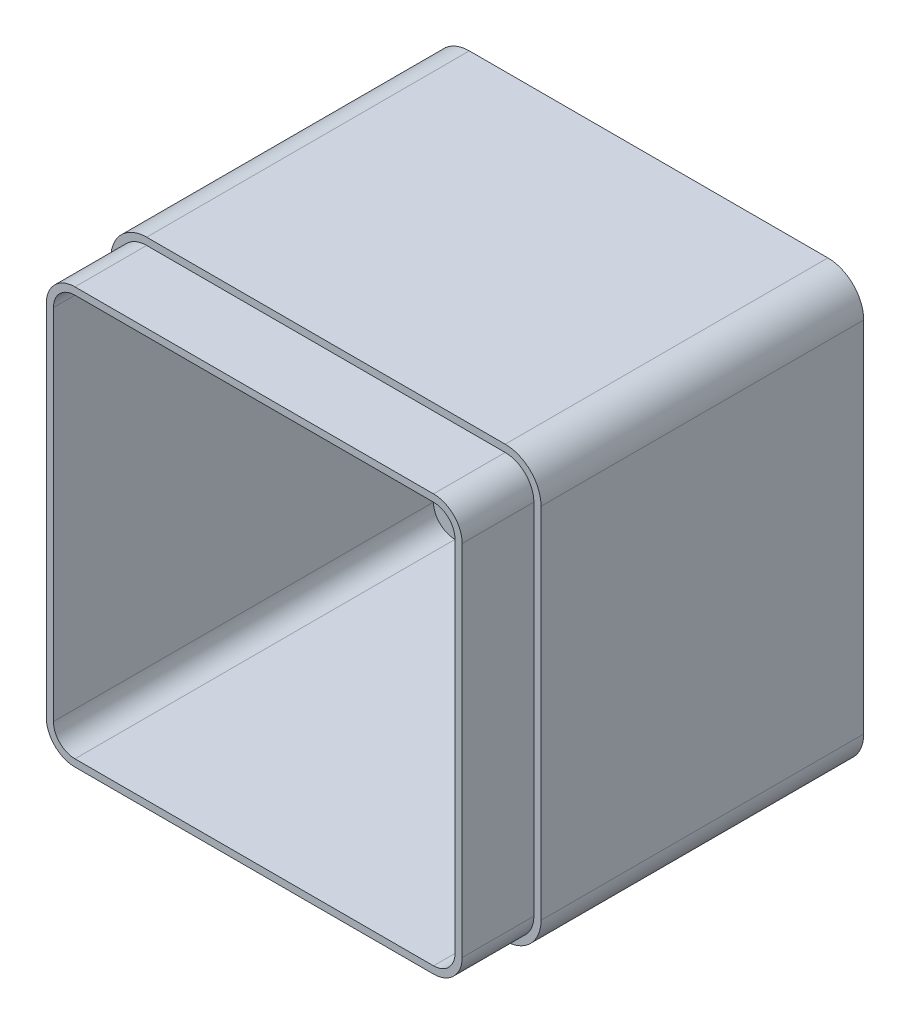
ISO-10303-21;
HEADER;
FILE_DESCRIPTION(('STEP AP214'),'2;1');
FILE_NAME('part.step','',(''),(''),'','','');
FILE_SCHEMA(('AUTOMOTIVE_DESIGN { 1 0 10303 214 1 1 1 1 }'));
ENDSEC;
DATA;
#1=APPLICATION_CONTEXT('core data for automotive mechanical design processes');
#2=APPLICATION_PROTOCOL_DEFINITION('international standard','automotive_design',2000,#1);
#3=PRODUCT_CONTEXT('',#1,'mechanical');
#4=PRODUCT('Part','Part','',(#3));
#5=PRODUCT_RELATED_PRODUCT_CATEGORY('part','',(#4));
#6=PRODUCT_DEFINITION_FORMATION('','',#4);
#7=PRODUCT_DEFINITION_CONTEXT('part definition',#1,'design');
#8=PRODUCT_DEFINITION('design','',#6,#7);
#9=PRODUCT_DEFINITION_SHAPE('','',#8);
#10=(LENGTH_UNIT() NAMED_UNIT(*) SI_UNIT(.MILLI.,.METRE.));
#11=(NAMED_UNIT(*) PLANE_ANGLE_UNIT() SI_UNIT($,.RADIAN.));
#12=(NAMED_UNIT(*) SI_UNIT($,.STERADIAN.) SOLID_ANGLE_UNIT());
#13=UNCERTAINTY_MEASURE_WITH_UNIT(LENGTH_MEASURE(1.E-05),#10,'distance_accuracy_value','');
#14=(GEOMETRIC_REPRESENTATION_CONTEXT(3) GLOBAL_UNCERTAINTY_ASSIGNED_CONTEXT((#13)) GLOBAL_UNIT_ASSIGNED_CONTEXT((#10,
#11,#12)) REPRESENTATION_CONTEXT('',''));
#15=CARTESIAN_POINT('',(0.,0.,0.));
#16=DIRECTION('',(0.,0.,1.));
#17=DIRECTION('',(1.,0.,0.));
#18=AXIS2_PLACEMENT_3D('',#15,#16,#17);
#19=CARTESIAN_POINT('',(0.,0.,90.));
#20=DIRECTION('',(0.,0.,-1.));
#21=DIRECTION('',(-1.,0.,0.));
#22=AXIS2_PLACEMENT_3D('',#19,#20,#21);
#23=PLANE('',#22);
#24=DIRECTION('',(0.,-1.,0.));
#25=VECTOR('',#24,1.);
#26=CARTESIAN_POINT('',(0.,0.,90.));
#27=LINE('',#26,#25);
#28=CARTESIAN_POINT('',(0.,110.,90.));
#29=VERTEX_POINT('',#28);
#30=CARTESIAN_POINT('',(0.,10.,90.));
#31=VERTEX_POINT('',#30);
#32=EDGE_CURVE('E329',#29,#31,#27,.T.);
#33=ORIENTED_EDGE('',*,*,#32,.T.);
#34=CARTESIAN_POINT('',(10.,10.,90.));
#35=DIRECTION('',(0.,0.,-1.));
#36=DIRECTION('',(-1.,0.,0.));
#37=AXIS2_PLACEMENT_3D('',#34,#35,#36);
#38=CIRCLE('',#37,10.);
#39=CARTESIAN_POINT('',(10.,0.,90.));
#40=VERTEX_POINT('',#39);
#41=EDGE_CURVE('E376',#31,#40,#38,.F.);
#42=ORIENTED_EDGE('',*,*,#41,.T.);
#43=DIRECTION('',(1.,0.,0.));
#44=VECTOR('',#43,1.);
#45=CARTESIAN_POINT('',(0.,0.,90.));
#46=LINE('',#45,#44);
#47=CARTESIAN_POINT('',(110.,0.,90.));
#48=VERTEX_POINT('',#47);
#49=EDGE_CURVE('E332',#40,#48,#46,.T.);
#50=ORIENTED_EDGE('',*,*,#49,.T.);
#51=CARTESIAN_POINT('',(110.,10.,90.));
#52=DIRECTION('',(0.,0.,-1.));
#53=DIRECTION('',(-1.,0.,0.));
#54=AXIS2_PLACEMENT_3D('',#51,#52,#53);
#55=CIRCLE('',#54,10.);
#56=CARTESIAN_POINT('',(120.,10.,90.));
#57=VERTEX_POINT('',#56);
#58=EDGE_CURVE('E374',#48,#57,#55,.F.);
#59=ORIENTED_EDGE('',*,*,#58,.T.);
#60=DIRECTION('',(0.,1.,0.));
#61=VECTOR('',#60,1.);
#62=CARTESIAN_POINT('',(120.,0.,90.));
#63=LINE('',#62,#61);
#64=CARTESIAN_POINT('',(120.,110.,90.));
#65=VERTEX_POINT('',#64);
#66=EDGE_CURVE('E336',#57,#65,#63,.T.);
#67=ORIENTED_EDGE('',*,*,#66,.T.);
#68=CARTESIAN_POINT('',(110.,110.,90.));
#69=DIRECTION('',(0.,0.,-1.));
#70=DIRECTION('',(-1.,0.,0.));
#71=AXIS2_PLACEMENT_3D('',#68,#69,#70);
#72=CIRCLE('',#71,10.);
#73=CARTESIAN_POINT('',(110.,120.,90.));
#74=VERTEX_POINT('',#73);
#75=EDGE_CURVE('E370',#65,#74,#72,.F.);
#76=ORIENTED_EDGE('',*,*,#75,.T.);
#77=DIRECTION('',(-1.,0.,0.));
#78=VECTOR('',#77,1.);
#79=CARTESIAN_POINT('',(0.,120.,90.));
#80=LINE('',#79,#78);
#81=CARTESIAN_POINT('',(10.,120.,90.));
#82=VERTEX_POINT('',#81);
#83=EDGE_CURVE('E339',#74,#82,#80,.T.);
#84=ORIENTED_EDGE('',*,*,#83,.T.);
#85=CARTESIAN_POINT('',(10.,110.,90.));
#86=DIRECTION('',(0.,0.,-1.));
#87=DIRECTION('',(-1.,0.,0.));
#88=AXIS2_PLACEMENT_3D('',#85,#86,#87);
#89=CIRCLE('',#88,10.);
#90=EDGE_CURVE('E372',#82,#29,#89,.F.);
#91=ORIENTED_EDGE('',*,*,#90,.T.);
#92=EDGE_LOOP('',(#33,#42,#50,#59,#67,#76,#84,#91));
#93=FACE_BOUND('',#92,.T.);
#94=DIRECTION('',(-1.,0.,0.));
#95=VECTOR('',#94,1.);
#96=CARTESIAN_POINT('',(0.,118.,90.));
#97=LINE('',#96,#95);
#98=CARTESIAN_POINT('',(110.,118.,90.));
#99=VERTEX_POINT('',#98);
#100=CARTESIAN_POINT('',(9.99999999999999,118.,90.));
#101=VERTEX_POINT('',#100);
#102=EDGE_CURVE('E258',#99,#101,#97,.T.);
#103=ORIENTED_EDGE('',*,*,#102,.F.);
#104=CARTESIAN_POINT('',(110.,110.,90.));
#105=DIRECTION('',(0.,0.,1.));
#106=DIRECTION('',(1.,0.,0.));
#107=AXIS2_PLACEMENT_3D('',#104,#105,#106);
#108=CIRCLE('',#107,7.99999999999999);
#109=CARTESIAN_POINT('',(118.,110.,90.));
#110=VERTEX_POINT('',#109);
#111=EDGE_CURVE('E221',#110,#99,#108,.T.);
#112=ORIENTED_EDGE('',*,*,#111,.F.);
#113=DIRECTION('',(0.,1.,0.));
#114=VECTOR('',#113,1.);
#115=CARTESIAN_POINT('',(118.,0.,90.));
#116=LINE('',#115,#114);
#117=CARTESIAN_POINT('',(118.,10.,90.));
#118=VERTEX_POINT('',#117);
#119=EDGE_CURVE('E224',#118,#110,#116,.T.);
#120=ORIENTED_EDGE('',*,*,#119,.F.);
#121=CARTESIAN_POINT('',(110.,10.,90.));
#122=DIRECTION('',(0.,0.,1.));
#123=DIRECTION('',(1.,0.,0.));
#124=AXIS2_PLACEMENT_3D('',#121,#122,#123);
#125=CIRCLE('',#124,7.99999999999999);
#126=CARTESIAN_POINT('',(110.,2.,90.));
#127=VERTEX_POINT('',#126);
#128=EDGE_CURVE('E269',#127,#118,#125,.T.);
#129=ORIENTED_EDGE('',*,*,#128,.F.);
#130=DIRECTION('',(1.,0.,0.));
#131=VECTOR('',#130,1.);
#132=CARTESIAN_POINT('',(0.,2.,90.));
#133=LINE('',#132,#131);
#134=CARTESIAN_POINT('',(10.,2.,90.));
#135=VERTEX_POINT('',#134);
#136=EDGE_CURVE('E266',#135,#127,#133,.T.);
#137=ORIENTED_EDGE('',*,*,#136,.F.);
#138=CARTESIAN_POINT('',(10.,10.,90.));
#139=DIRECTION('',(0.,0.,1.));
#140=DIRECTION('',(1.,0.,0.));
#141=AXIS2_PLACEMENT_3D('',#138,#139,#140);
#142=CIRCLE('',#141,8.);
#143=CARTESIAN_POINT('',(2.,10.,90.));
#144=VERTEX_POINT('',#143);
#145=EDGE_CURVE('E263',#144,#135,#142,.T.);
#146=ORIENTED_EDGE('',*,*,#145,.F.);
#147=DIRECTION('',(0.,-1.,0.));
#148=VECTOR('',#147,1.);
#149=CARTESIAN_POINT('',(2.,0.,90.));
#150=LINE('',#149,#148);
#151=CARTESIAN_POINT('',(2.,110.,90.));
#152=VERTEX_POINT('',#151);
#153=EDGE_CURVE('E55',#152,#144,#150,.T.);
#154=ORIENTED_EDGE('',*,*,#153,.F.);
#155=CARTESIAN_POINT('',(10.,110.,90.));
#156=DIRECTION('',(0.,0.,1.));
#157=DIRECTION('',(1.,0.,0.));
#158=AXIS2_PLACEMENT_3D('',#155,#156,#157);
#159=CIRCLE('',#158,8.);
#160=EDGE_CURVE('E50',#101,#152,#159,.T.);
#161=ORIENTED_EDGE('',*,*,#160,.F.);
#162=EDGE_LOOP('',(#103,#112,#120,#129,#137,#146,#154,#161));
#163=FACE_BOUND('',#162,.T.);
#164=ADVANCED_FACE('F35',(#93,#163),#23,.F.);
#165=CARTESIAN_POINT('',(0.,0.,90.));
#166=DIRECTION('',(1.,0.,0.));
#167=DIRECTION('',(0.,0.,-1.));
#168=AXIS2_PLACEMENT_3D('',#165,#166,#167);
#169=PLANE('',#168);
#170=DIRECTION('',(0.,-1.,0.));
#171=VECTOR('',#170,1.);
#172=CARTESIAN_POINT('',(0.,0.,0.));
#173=LINE('',#172,#171);
#174=CARTESIAN_POINT('',(0.,110.,0.));
#175=VERTEX_POINT('',#174);
#176=CARTESIAN_POINT('',(0.,10.,0.));
#177=VERTEX_POINT('',#176);
#178=EDGE_CURVE('E328',#175,#177,#173,.T.);
#179=ORIENTED_EDGE('',*,*,#178,.T.);
#180=DIRECTION('',(0.,0.,-1.));
#181=VECTOR('',#180,1.);
#182=CARTESIAN_POINT('',(0.,10.,90.));
#183=LINE('',#182,#181);
#184=EDGE_CURVE('E368',#177,#31,#183,.F.);
#185=ORIENTED_EDGE('',*,*,#184,.T.);
#186=ORIENTED_EDGE('',*,*,#32,.F.);
#187=DIRECTION('',(0.,0.,-1.));
#188=VECTOR('',#187,1.);
#189=CARTESIAN_POINT('',(0.,110.,90.));
#190=LINE('',#189,#188);
#191=EDGE_CURVE('E365',#29,#175,#190,.T.);
#192=ORIENTED_EDGE('',*,*,#191,.T.);
#193=EDGE_LOOP('',(#179,#185,#186,#192));
#194=FACE_BOUND('',#193,.T.);
#195=ADVANCED_FACE('F402',(#194),#169,.F.);
#196=CARTESIAN_POINT('',(0.,0.,90.));
#197=DIRECTION('',(0.,1.,0.));
#198=DIRECTION('',(0.,0.,1.));
#199=AXIS2_PLACEMENT_3D('',#196,#197,#198);
#200=PLANE('',#199);
#201=ORIENTED_EDGE('',*,*,#49,.F.);
#202=DIRECTION('',(0.,0.,-1.));
#203=VECTOR('',#202,1.);
#204=CARTESIAN_POINT('',(10.,0.,90.));
#205=LINE('',#204,#203);
#206=CARTESIAN_POINT('',(10.,0.,0.));
#207=VERTEX_POINT('',#206);
#208=EDGE_CURVE('E354',#40,#207,#205,.T.);
#209=ORIENTED_EDGE('',*,*,#208,.T.);
#210=DIRECTION('',(1.,0.,0.));
#211=VECTOR('',#210,1.);
#212=CARTESIAN_POINT('',(0.,0.,0.));
#213=LINE('',#212,#211);
#214=CARTESIAN_POINT('',(110.,0.,0.));
#215=VERTEX_POINT('',#214);
#216=EDGE_CURVE('E345',#207,#215,#213,.T.);
#217=ORIENTED_EDGE('',*,*,#216,.T.);
#218=DIRECTION('',(0.,0.,-1.));
#219=VECTOR('',#218,1.);
#220=CARTESIAN_POINT('',(110.,0.,90.));
#221=LINE('',#220,#219);
#222=EDGE_CURVE('E342',#215,#48,#221,.F.);
#223=ORIENTED_EDGE('',*,*,#222,.T.);
#224=EDGE_LOOP('',(#201,#209,#217,#223));
#225=FACE_BOUND('',#224,.T.);
#226=ADVANCED_FACE('F411',(#225),#200,.F.);
#227=CARTESIAN_POINT('',(120.,0.,90.));
#228=DIRECTION('',(-1.,0.,0.));
#229=DIRECTION('',(0.,0.,1.));
#230=AXIS2_PLACEMENT_3D('',#227,#228,#229);
#231=PLANE('',#230);
#232=ORIENTED_EDGE('',*,*,#66,.F.);
#233=DIRECTION('',(0.,0.,-1.));
#234=VECTOR('',#233,1.);
#235=CARTESIAN_POINT('',(120.,10.,90.));
#236=LINE('',#235,#234);
#237=CARTESIAN_POINT('',(120.,10.,0.));
#238=VERTEX_POINT('',#237);
#239=EDGE_CURVE('E380',#57,#238,#236,.T.);
#240=ORIENTED_EDGE('',*,*,#239,.T.);
#241=DIRECTION('',(0.,1.,0.));
#242=VECTOR('',#241,1.);
#243=CARTESIAN_POINT('',(120.,0.,0.));
#244=LINE('',#243,#242);
#245=CARTESIAN_POINT('',(120.,110.,0.));
#246=VERTEX_POINT('',#245);
#247=EDGE_CURVE('E348',#238,#246,#244,.T.);
#248=ORIENTED_EDGE('',*,*,#247,.T.);
#249=DIRECTION('',(0.,0.,-1.));
#250=VECTOR('',#249,1.);
#251=CARTESIAN_POINT('',(120.,110.,90.));
#252=LINE('',#251,#250);
#253=EDGE_CURVE('E378',#246,#65,#252,.F.);
#254=ORIENTED_EDGE('',*,*,#253,.T.);
#255=EDGE_LOOP('',(#232,#240,#248,#254));
#256=FACE_BOUND('',#255,.T.);
#257=ADVANCED_FACE('F419',(#256),#231,.F.);
#258=CARTESIAN_POINT('',(0.,120.,90.));
#259=DIRECTION('',(0.,-1.,0.));
#260=DIRECTION('',(0.,0.,-1.));
#261=AXIS2_PLACEMENT_3D('',#258,#259,#260);
#262=PLANE('',#261);
#263=DIRECTION('',(-1.,0.,0.));
#264=VECTOR('',#263,1.);
#265=CARTESIAN_POINT('',(0.,120.,0.));
#266=LINE('',#265,#264);
#267=CARTESIAN_POINT('',(110.,120.,0.));
#268=VERTEX_POINT('',#267);
#269=CARTESIAN_POINT('',(10.,120.,0.));
#270=VERTEX_POINT('',#269);
#271=EDGE_CURVE('E333',#268,#270,#266,.T.);
#272=ORIENTED_EDGE('',*,*,#271,.T.);
#273=DIRECTION('',(0.,0.,-1.));
#274=VECTOR('',#273,1.);
#275=CARTESIAN_POINT('',(10.,120.,90.));
#276=LINE('',#275,#274);
#277=EDGE_CURVE('E11',#270,#82,#276,.F.);
#278=ORIENTED_EDGE('',*,*,#277,.T.);
#279=ORIENTED_EDGE('',*,*,#83,.F.);
#280=DIRECTION('',(0.,0.,-1.));
#281=VECTOR('',#280,1.);
#282=CARTESIAN_POINT('',(110.,120.,90.));
#283=LINE('',#282,#281);
#284=EDGE_CURVE('E43',#74,#268,#283,.T.);
#285=ORIENTED_EDGE('',*,*,#284,.T.);
#286=EDGE_LOOP('',(#272,#278,#279,#285));
#287=FACE_BOUND('',#286,.T.);
#288=ADVANCED_FACE('F387',(#287),#262,.F.);
#289=CARTESIAN_POINT('',(0.,0.,0.));
#290=DIRECTION('',(0.,0.,-1.));
#291=DIRECTION('',(-1.,0.,0.));
#292=AXIS2_PLACEMENT_3D('',#289,#290,#291);
#293=PLANE('',#292);
#294=ORIENTED_EDGE('',*,*,#216,.F.);
#295=CARTESIAN_POINT('',(10.,10.,0.));
#296=DIRECTION('',(0.,0.,-1.));
#297=DIRECTION('',(-1.,0.,0.));
#298=AXIS2_PLACEMENT_3D('',#295,#296,#297);
#299=CIRCLE('',#298,10.);
#300=EDGE_CURVE('E363',#207,#177,#299,.T.);
#301=ORIENTED_EDGE('',*,*,#300,.T.);
#302=ORIENTED_EDGE('',*,*,#178,.F.);
#303=CARTESIAN_POINT('',(10.,110.,0.));
#304=DIRECTION('',(0.,0.,-1.));
#305=DIRECTION('',(-1.,0.,0.));
#306=AXIS2_PLACEMENT_3D('',#303,#304,#305);
#307=CIRCLE('',#306,10.);
#308=EDGE_CURVE('E359',#175,#270,#307,.T.);
#309=ORIENTED_EDGE('',*,*,#308,.T.);
#310=ORIENTED_EDGE('',*,*,#271,.F.);
#311=CARTESIAN_POINT('',(110.,110.,0.));
#312=DIRECTION('',(0.,0.,-1.));
#313=DIRECTION('',(-1.,0.,0.));
#314=AXIS2_PLACEMENT_3D('',#311,#312,#313);
#315=CIRCLE('',#314,10.);
#316=EDGE_CURVE('E357',#268,#246,#315,.T.);
#317=ORIENTED_EDGE('',*,*,#316,.T.);
#318=ORIENTED_EDGE('',*,*,#247,.F.);
#319=CARTESIAN_POINT('',(110.,10.,0.));
#320=DIRECTION('',(0.,0.,-1.));
#321=DIRECTION('',(-1.,0.,0.));
#322=AXIS2_PLACEMENT_3D('',#319,#320,#321);
#323=CIRCLE('',#322,10.);
#324=EDGE_CURVE('E361',#238,#215,#323,.T.);
#325=ORIENTED_EDGE('',*,*,#324,.T.);
#326=EDGE_LOOP('',(#294,#301,#302,#309,#310,#317,#318,#325));
#327=FACE_BOUND('',#326,.T.);
#328=ADVANCED_FACE('F393',(#327),#293,.T.);
#329=CARTESIAN_POINT('',(10.,10.,90.));
#330=DIRECTION('',(0.,0.,-1.));
#331=DIRECTION('',(-1.,0.,0.));
#332=AXIS2_PLACEMENT_3D('',#329,#330,#331);
#333=CYLINDRICAL_SURFACE('',#332,10.);
#334=ORIENTED_EDGE('',*,*,#41,.F.);
#335=ORIENTED_EDGE('',*,*,#184,.F.);
#336=ORIENTED_EDGE('',*,*,#300,.F.);
#337=ORIENTED_EDGE('',*,*,#208,.F.);
#338=EDGE_LOOP('',(#334,#335,#336,#337));
#339=FACE_BOUND('',#338,.T.);
#340=ADVANCED_FACE('F409',(#339),#333,.T.);
#341=CARTESIAN_POINT('',(110.,10.,90.));
#342=DIRECTION('',(0.,0.,-1.));
#343=DIRECTION('',(-1.,0.,0.));
#344=AXIS2_PLACEMENT_3D('',#341,#342,#343);
#345=CYLINDRICAL_SURFACE('',#344,10.);
#346=ORIENTED_EDGE('',*,*,#58,.F.);
#347=ORIENTED_EDGE('',*,*,#222,.F.);
#348=ORIENTED_EDGE('',*,*,#324,.F.);
#349=ORIENTED_EDGE('',*,*,#239,.F.);
#350=EDGE_LOOP('',(#346,#347,#348,#349));
#351=FACE_BOUND('',#350,.T.);
#352=ADVANCED_FACE('F416',(#351),#345,.T.);
#353=CARTESIAN_POINT('',(10.,110.,90.));
#354=DIRECTION('',(0.,0.,-1.));
#355=DIRECTION('',(-1.,0.,0.));
#356=AXIS2_PLACEMENT_3D('',#353,#354,#355);
#357=CYLINDRICAL_SURFACE('',#356,10.);
#358=ORIENTED_EDGE('',*,*,#90,.F.);
#359=ORIENTED_EDGE('',*,*,#277,.F.);
#360=ORIENTED_EDGE('',*,*,#308,.F.);
#361=ORIENTED_EDGE('',*,*,#191,.F.);
#362=EDGE_LOOP('',(#358,#359,#360,#361));
#363=FACE_BOUND('',#362,.T.);
#364=ADVANCED_FACE('F399',(#363),#357,.T.);
#365=CARTESIAN_POINT('',(110.,110.,90.));
#366=DIRECTION('',(0.,0.,-1.));
#367=DIRECTION('',(-1.,0.,0.));
#368=AXIS2_PLACEMENT_3D('',#365,#366,#367);
#369=CYLINDRICAL_SURFACE('',#368,10.);
#370=ORIENTED_EDGE('',*,*,#75,.F.);
#371=ORIENTED_EDGE('',*,*,#253,.F.);
#372=ORIENTED_EDGE('',*,*,#316,.F.);
#373=ORIENTED_EDGE('',*,*,#284,.F.);
#374=EDGE_LOOP('',(#370,#371,#372,#373));
#375=FACE_BOUND('',#374,.T.);
#376=ADVANCED_FACE('F37',(#375),#369,.T.);
#377=CARTESIAN_POINT('',(0.,118.,110.));
#378=DIRECTION('',(0.,-1.,0.));
#379=DIRECTION('',(0.,0.,-1.));
#380=AXIS2_PLACEMENT_3D('',#377,#378,#379);
#381=PLANE('',#380);
#382=ORIENTED_EDGE('',*,*,#102,.T.);
#383=DIRECTION('',(0.,0.,-1.));
#384=VECTOR('',#383,1.);
#385=CARTESIAN_POINT('',(9.99999999999999,118.,110.));
#386=LINE('',#385,#384);
#387=CARTESIAN_POINT('',(9.99999999999999,118.,110.));
#388=VERTEX_POINT('',#387);
#389=EDGE_CURVE('E294',#388,#101,#386,.T.);
#390=ORIENTED_EDGE('',*,*,#389,.F.);
#391=DIRECTION('',(-1.,0.,0.));
#392=VECTOR('',#391,1.);
#393=CARTESIAN_POINT('',(0.,118.,110.));
#394=LINE('',#393,#392);
#395=CARTESIAN_POINT('',(110.,118.,110.));
#396=VERTEX_POINT('',#395);
#397=EDGE_CURVE('E240',#396,#388,#394,.T.);
#398=ORIENTED_EDGE('',*,*,#397,.F.);
#399=DIRECTION('',(0.,0.,-1.));
#400=VECTOR('',#399,1.);
#401=CARTESIAN_POINT('',(110.,118.,110.));
#402=LINE('',#401,#400);
#403=EDGE_CURVE('E257',#396,#99,#402,.T.);
#404=ORIENTED_EDGE('',*,*,#403,.T.);
#405=EDGE_LOOP('',(#382,#390,#398,#404));
#406=FACE_BOUND('',#405,.T.);
#407=ADVANCED_FACE('F422',(#406),#381,.F.);
#408=CARTESIAN_POINT('',(10.,110.,110.));
#409=DIRECTION('',(0.,0.,-1.));
#410=DIRECTION('',(-1.,0.,0.));
#411=AXIS2_PLACEMENT_3D('',#408,#409,#410);
#412=CYLINDRICAL_SURFACE('',#411,8.);
#413=ORIENTED_EDGE('',*,*,#160,.T.);
#414=DIRECTION('',(0.,0.,-1.));
#415=VECTOR('',#414,1.);
#416=CARTESIAN_POINT('',(2.,110.,110.));
#417=LINE('',#416,#415);
#418=CARTESIAN_POINT('',(2.,110.,110.));
#419=VERTEX_POINT('',#418);
#420=EDGE_CURVE('E291',#419,#152,#417,.T.);
#421=ORIENTED_EDGE('',*,*,#420,.F.);
#422=CARTESIAN_POINT('',(10.,110.,110.));
#423=DIRECTION('',(0.,0.,1.));
#424=DIRECTION('',(1.,0.,0.));
#425=AXIS2_PLACEMENT_3D('',#422,#423,#424);
#426=CIRCLE('',#425,8.);
#427=EDGE_CURVE('E243',#388,#419,#426,.T.);
#428=ORIENTED_EDGE('',*,*,#427,.F.);
#429=ORIENTED_EDGE('',*,*,#389,.T.);
#430=EDGE_LOOP('',(#413,#421,#428,#429));
#431=FACE_BOUND('',#430,.T.);
#432=ADVANCED_FACE('F428',(#431),#412,.T.);
#433=CARTESIAN_POINT('',(2.,0.,110.));
#434=DIRECTION('',(1.,0.,0.));
#435=DIRECTION('',(0.,0.,-1.));
#436=AXIS2_PLACEMENT_3D('',#433,#434,#435);
#437=PLANE('',#436);
#438=ORIENTED_EDGE('',*,*,#153,.T.);
#439=DIRECTION('',(0.,0.,-1.));
#440=VECTOR('',#439,1.);
#441=CARTESIAN_POINT('',(2.,9.99999999999999,110.));
#442=LINE('',#441,#440);
#443=CARTESIAN_POINT('',(2.,9.99999999999999,110.));
#444=VERTEX_POINT('',#443);
#445=EDGE_CURVE('E288',#444,#144,#442,.T.);
#446=ORIENTED_EDGE('',*,*,#445,.F.);
#447=DIRECTION('',(0.,-1.,0.));
#448=VECTOR('',#447,1.);
#449=CARTESIAN_POINT('',(2.,0.,110.));
#450=LINE('',#449,#448);
#451=EDGE_CURVE('E245',#419,#444,#450,.T.);
#452=ORIENTED_EDGE('',*,*,#451,.F.);
#453=ORIENTED_EDGE('',*,*,#420,.T.);
#454=EDGE_LOOP('',(#438,#446,#452,#453));
#455=FACE_BOUND('',#454,.T.);
#456=ADVANCED_FACE('F493',(#455),#437,.F.);
#457=CARTESIAN_POINT('',(10.,10.,110.));
#458=DIRECTION('',(0.,0.,-1.));
#459=DIRECTION('',(-1.,0.,0.));
#460=AXIS2_PLACEMENT_3D('',#457,#458,#459);
#461=CYLINDRICAL_SURFACE('',#460,8.);
#462=ORIENTED_EDGE('',*,*,#145,.T.);
#463=DIRECTION('',(0.,0.,-1.));
#464=VECTOR('',#463,1.);
#465=CARTESIAN_POINT('',(10.,2.,110.));
#466=LINE('',#465,#464);
#467=CARTESIAN_POINT('',(10.,2.,110.));
#468=VERTEX_POINT('',#467);
#469=EDGE_CURVE('E285',#468,#135,#466,.T.);
#470=ORIENTED_EDGE('',*,*,#469,.F.);
#471=CARTESIAN_POINT('',(10.,10.,110.));
#472=DIRECTION('',(0.,0.,1.));
#473=DIRECTION('',(1.,0.,0.));
#474=AXIS2_PLACEMENT_3D('',#471,#472,#473);
#475=CIRCLE('',#474,8.);
#476=EDGE_CURVE('E247',#444,#468,#475,.T.);
#477=ORIENTED_EDGE('',*,*,#476,.F.);
#478=ORIENTED_EDGE('',*,*,#445,.T.);
#479=EDGE_LOOP('',(#462,#470,#477,#478));
#480=FACE_BOUND('',#479,.T.);
#481=ADVANCED_FACE('F501',(#480),#461,.T.);
#482=CARTESIAN_POINT('',(0.,2.,110.));
#483=DIRECTION('',(0.,1.,0.));
#484=DIRECTION('',(0.,0.,1.));
#485=AXIS2_PLACEMENT_3D('',#482,#483,#484);
#486=PLANE('',#485);
#487=ORIENTED_EDGE('',*,*,#136,.T.);
#488=DIRECTION('',(0.,0.,-1.));
#489=VECTOR('',#488,1.);
#490=CARTESIAN_POINT('',(110.,2.,110.));
#491=LINE('',#490,#489);
#492=CARTESIAN_POINT('',(110.,2.,110.));
#493=VERTEX_POINT('',#492);
#494=EDGE_CURVE('E282',#493,#127,#491,.T.);
#495=ORIENTED_EDGE('',*,*,#494,.F.);
#496=DIRECTION('',(1.,0.,0.));
#497=VECTOR('',#496,1.);
#498=CARTESIAN_POINT('',(0.,2.,110.));
#499=LINE('',#498,#497);
#500=EDGE_CURVE('E249',#468,#493,#499,.T.);
#501=ORIENTED_EDGE('',*,*,#500,.F.);
#502=ORIENTED_EDGE('',*,*,#469,.T.);
#503=EDGE_LOOP('',(#487,#495,#501,#502));
#504=FACE_BOUND('',#503,.T.);
#505=ADVANCED_FACE('F509',(#504),#486,.F.);
#506=CARTESIAN_POINT('',(110.,10.,110.));
#507=DIRECTION('',(0.,0.,-1.));
#508=DIRECTION('',(-1.,0.,0.));
#509=AXIS2_PLACEMENT_3D('',#506,#507,#508);
#510=CYLINDRICAL_SURFACE('',#509,7.99999999999999);
#511=ORIENTED_EDGE('',*,*,#128,.T.);
#512=DIRECTION('',(0.,0.,-1.));
#513=VECTOR('',#512,1.);
#514=CARTESIAN_POINT('',(118.,10.,110.));
#515=LINE('',#514,#513);
#516=CARTESIAN_POINT('',(118.,10.,110.));
#517=VERTEX_POINT('',#516);
#518=EDGE_CURVE('E279',#517,#118,#515,.T.);
#519=ORIENTED_EDGE('',*,*,#518,.F.);
#520=CARTESIAN_POINT('',(110.,10.,110.));
#521=DIRECTION('',(0.,0.,1.));
#522=DIRECTION('',(1.,0.,0.));
#523=AXIS2_PLACEMENT_3D('',#520,#521,#522);
#524=CIRCLE('',#523,7.99999999999999);
#525=EDGE_CURVE('E251',#493,#517,#524,.T.);
#526=ORIENTED_EDGE('',*,*,#525,.F.);
#527=ORIENTED_EDGE('',*,*,#494,.T.);
#528=EDGE_LOOP('',(#511,#519,#526,#527));
#529=FACE_BOUND('',#528,.T.);
#530=ADVANCED_FACE('F517',(#529),#510,.T.);
#531=CARTESIAN_POINT('',(118.,0.,110.));
#532=DIRECTION('',(-1.,0.,0.));
#533=DIRECTION('',(0.,0.,1.));
#534=AXIS2_PLACEMENT_3D('',#531,#532,#533);
#535=PLANE('',#534);
#536=ORIENTED_EDGE('',*,*,#119,.T.);
#537=DIRECTION('',(0.,0.,-1.));
#538=VECTOR('',#537,1.);
#539=CARTESIAN_POINT('',(118.,110.,110.));
#540=LINE('',#539,#538);
#541=CARTESIAN_POINT('',(118.,110.,110.));
#542=VERTEX_POINT('',#541);
#543=EDGE_CURVE('E276',#542,#110,#540,.T.);
#544=ORIENTED_EDGE('',*,*,#543,.F.);
#545=DIRECTION('',(0.,1.,0.));
#546=VECTOR('',#545,1.);
#547=CARTESIAN_POINT('',(118.,0.,110.));
#548=LINE('',#547,#546);
#549=EDGE_CURVE('E253',#517,#542,#548,.T.);
#550=ORIENTED_EDGE('',*,*,#549,.F.);
#551=ORIENTED_EDGE('',*,*,#518,.T.);
#552=EDGE_LOOP('',(#536,#544,#550,#551));
#553=FACE_BOUND('',#552,.T.);
#554=ADVANCED_FACE('F525',(#553),#535,.F.);
#555=CARTESIAN_POINT('',(110.,110.,110.));
#556=DIRECTION('',(0.,0.,-1.));
#557=DIRECTION('',(-1.,0.,0.));
#558=AXIS2_PLACEMENT_3D('',#555,#556,#557);
#559=CYLINDRICAL_SURFACE('',#558,7.99999999999999);
#560=ORIENTED_EDGE('',*,*,#111,.T.);
#561=ORIENTED_EDGE('',*,*,#403,.F.);
#562=CARTESIAN_POINT('',(110.,110.,110.));
#563=DIRECTION('',(0.,0.,1.));
#564=DIRECTION('',(1.,0.,0.));
#565=AXIS2_PLACEMENT_3D('',#562,#563,#564);
#566=CIRCLE('',#565,7.99999999999999);
#567=EDGE_CURVE('E255',#542,#396,#566,.T.);
#568=ORIENTED_EDGE('',*,*,#567,.F.);
#569=ORIENTED_EDGE('',*,*,#543,.T.);
#570=EDGE_LOOP('',(#560,#561,#568,#569));
#571=FACE_BOUND('',#570,.T.);
#572=ADVANCED_FACE('F533',(#571),#559,.T.);
#573=CARTESIAN_POINT('',(0.,0.,110.));
#574=DIRECTION('',(0.,0.,1.));
#575=DIRECTION('',(1.,0.,0.));
#576=AXIS2_PLACEMENT_3D('',#573,#574,#575);
#577=PLANE('',#576);
#578=CARTESIAN_POINT('',(10.,10.,110.));
#579=DIRECTION('',(0.,0.,1.));
#580=DIRECTION('',(1.,0.,0.));
#581=AXIS2_PLACEMENT_3D('',#578,#579,#580);
#582=CIRCLE('',#581,6.);
#583=CARTESIAN_POINT('',(10.,4.,110.));
#584=VERTEX_POINT('',#583);
#585=CARTESIAN_POINT('',(4.,9.99999999999999,110.));
#586=VERTEX_POINT('',#585);
#587=EDGE_CURVE('E198',#584,#586,#582,.F.);
#588=ORIENTED_EDGE('',*,*,#587,.T.);
#589=DIRECTION('',(0.,1.,0.));
#590=VECTOR('',#589,1.);
#591=CARTESIAN_POINT('',(4.,0.,110.));
#592=LINE('',#591,#590);
#593=CARTESIAN_POINT('',(4.,110.,110.));
#594=VERTEX_POINT('',#593);
#595=EDGE_CURVE('E207',#586,#594,#592,.T.);
#596=ORIENTED_EDGE('',*,*,#595,.T.);
#597=CARTESIAN_POINT('',(10.,110.,110.));
#598=DIRECTION('',(0.,0.,1.));
#599=DIRECTION('',(1.,0.,0.));
#600=AXIS2_PLACEMENT_3D('',#597,#598,#599);
#601=CIRCLE('',#600,6.);
#602=CARTESIAN_POINT('',(9.99999999999999,116.,110.));
#603=VERTEX_POINT('',#602);
#604=EDGE_CURVE('E213',#594,#603,#601,.F.);
#605=ORIENTED_EDGE('',*,*,#604,.T.);
#606=DIRECTION('',(1.,0.,0.));
#607=VECTOR('',#606,1.);
#608=CARTESIAN_POINT('',(0.,116.,110.));
#609=LINE('',#608,#607);
#610=CARTESIAN_POINT('',(110.,116.,110.));
#611=VERTEX_POINT('',#610);
#612=EDGE_CURVE('E228',#603,#611,#609,.T.);
#613=ORIENTED_EDGE('',*,*,#612,.T.);
#614=CARTESIAN_POINT('',(110.,110.,110.));
#615=DIRECTION('',(0.,0.,1.));
#616=DIRECTION('',(1.,0.,0.));
#617=AXIS2_PLACEMENT_3D('',#614,#615,#616);
#618=CIRCLE('',#617,6.);
#619=CARTESIAN_POINT('',(116.,110.,110.));
#620=VERTEX_POINT('',#619);
#621=EDGE_CURVE('E231',#611,#620,#618,.F.);
#622=ORIENTED_EDGE('',*,*,#621,.T.);
#623=DIRECTION('',(0.,-1.,0.));
#624=VECTOR('',#623,1.);
#625=CARTESIAN_POINT('',(116.,0.,110.));
#626=LINE('',#625,#624);
#627=CARTESIAN_POINT('',(116.,10.,110.));
#628=VERTEX_POINT('',#627);
#629=EDGE_CURVE('E234',#620,#628,#626,.T.);
#630=ORIENTED_EDGE('',*,*,#629,.T.);
#631=CARTESIAN_POINT('',(110.,10.,110.));
#632=DIRECTION('',(0.,0.,1.));
#633=DIRECTION('',(1.,0.,0.));
#634=AXIS2_PLACEMENT_3D('',#631,#632,#633);
#635=CIRCLE('',#634,6.);
#636=CARTESIAN_POINT('',(110.,4.,110.));
#637=VERTEX_POINT('',#636);
#638=EDGE_CURVE('E237',#628,#637,#635,.F.);
#639=ORIENTED_EDGE('',*,*,#638,.T.);
#640=DIRECTION('',(-1.,0.,0.));
#641=VECTOR('',#640,1.);
#642=CARTESIAN_POINT('',(0.,4.,110.));
#643=LINE('',#642,#641);
#644=EDGE_CURVE('E220',#637,#584,#643,.T.);
#645=ORIENTED_EDGE('',*,*,#644,.T.);
#646=EDGE_LOOP('',(#588,#596,#605,#613,#622,#630,#639,#645));
#647=FACE_BOUND('',#646,.T.);
#648=ORIENTED_EDGE('',*,*,#397,.T.);
#649=ORIENTED_EDGE('',*,*,#427,.T.);
#650=ORIENTED_EDGE('',*,*,#451,.T.);
#651=ORIENTED_EDGE('',*,*,#476,.T.);
#652=ORIENTED_EDGE('',*,*,#500,.T.);
#653=ORIENTED_EDGE('',*,*,#525,.T.);
#654=ORIENTED_EDGE('',*,*,#549,.T.);
#655=ORIENTED_EDGE('',*,*,#567,.T.);
#656=EDGE_LOOP('',(#648,#649,#650,#651,#652,#653,#654,#655));
#657=FACE_BOUND('',#656,.T.);
#658=ADVANCED_FACE('F216',(#647,#657),#577,.T.);
#659=CARTESIAN_POINT('',(0.,0.,4.));
#660=DIRECTION('',(0.,0.,-1.));
#661=DIRECTION('',(-1.,0.,0.));
#662=AXIS2_PLACEMENT_3D('',#659,#660,#661);
#663=PLANE('',#662);
#664=DIRECTION('',(1.,0.,0.));
#665=VECTOR('',#664,1.);
#666=CARTESIAN_POINT('',(0.,4.,4.));
#667=LINE('',#666,#665);
#668=CARTESIAN_POINT('',(9.99999999999999,4.,4.));
#669=VERTEX_POINT('',#668);
#670=CARTESIAN_POINT('',(110.,4.,4.));
#671=VERTEX_POINT('',#670);
#672=EDGE_CURVE('E297',#669,#671,#667,.T.);
#673=ORIENTED_EDGE('',*,*,#672,.T.);
#674=CARTESIAN_POINT('',(110.,10.,4.));
#675=DIRECTION('',(0.,0.,-1.));
#676=DIRECTION('',(-1.,0.,0.));
#677=AXIS2_PLACEMENT_3D('',#674,#675,#676);
#678=CIRCLE('',#677,6.);
#679=CARTESIAN_POINT('',(116.,9.99999999999999,4.));
#680=VERTEX_POINT('',#679);
#681=EDGE_CURVE('E304',#680,#671,#678,.T.);
#682=ORIENTED_EDGE('',*,*,#681,.F.);
#683=DIRECTION('',(0.,1.,0.));
#684=VECTOR('',#683,1.);
#685=CARTESIAN_POINT('',(116.,0.,4.));
#686=LINE('',#685,#684);
#687=CARTESIAN_POINT('',(116.,110.,4.));
#688=VERTEX_POINT('',#687);
#689=EDGE_CURVE('E302',#680,#688,#686,.T.);
#690=ORIENTED_EDGE('',*,*,#689,.T.);
#691=CARTESIAN_POINT('',(110.,110.,4.));
#692=DIRECTION('',(0.,0.,-1.));
#693=DIRECTION('',(-1.,0.,0.));
#694=AXIS2_PLACEMENT_3D('',#691,#692,#693);
#695=CIRCLE('',#694,6.);
#696=CARTESIAN_POINT('',(110.,116.,4.));
#697=VERTEX_POINT('',#696);
#698=EDGE_CURVE('E307',#697,#688,#695,.T.);
#699=ORIENTED_EDGE('',*,*,#698,.F.);
#700=DIRECTION('',(-1.,0.,0.));
#701=VECTOR('',#700,1.);
#702=CARTESIAN_POINT('',(0.,116.,4.));
#703=LINE('',#702,#701);
#704=CARTESIAN_POINT('',(9.99999999999999,116.,4.));
#705=VERTEX_POINT('',#704);
#706=EDGE_CURVE('E308',#697,#705,#703,.T.);
#707=ORIENTED_EDGE('',*,*,#706,.T.);
#708=CARTESIAN_POINT('',(10.,110.,4.));
#709=DIRECTION('',(0.,0.,-1.));
#710=DIRECTION('',(-1.,0.,0.));
#711=AXIS2_PLACEMENT_3D('',#708,#709,#710);
#712=CIRCLE('',#711,6.);
#713=CARTESIAN_POINT('',(4.,110.,4.));
#714=VERTEX_POINT('',#713);
#715=EDGE_CURVE('E305',#714,#705,#712,.T.);
#716=ORIENTED_EDGE('',*,*,#715,.F.);
#717=DIRECTION('',(0.,-1.,0.));
#718=VECTOR('',#717,1.);
#719=CARTESIAN_POINT('',(4.,0.,4.));
#720=LINE('',#719,#718);
#721=CARTESIAN_POINT('',(4.,9.99999999999999,4.));
#722=VERTEX_POINT('',#721);
#723=EDGE_CURVE('E296',#714,#722,#720,.T.);
#724=ORIENTED_EDGE('',*,*,#723,.T.);
#725=CARTESIAN_POINT('',(10.,10.,4.));
#726=DIRECTION('',(0.,0.,-1.));
#727=DIRECTION('',(-1.,0.,0.));
#728=AXIS2_PLACEMENT_3D('',#725,#726,#727);
#729=CIRCLE('',#728,6.);
#730=EDGE_CURVE('E199',#669,#722,#729,.T.);
#731=ORIENTED_EDGE('',*,*,#730,.F.);
#732=EDGE_LOOP('',(#673,#682,#690,#699,#707,#716,#724,#731));
#733=FACE_BOUND('',#732,.T.);
#734=ADVANCED_FACE('F471',(#733),#663,.F.);
#735=CARTESIAN_POINT('',(10.,10.,90.));
#736=DIRECTION('',(0.,0.,-1.));
#737=DIRECTION('',(-1.,0.,0.));
#738=AXIS2_PLACEMENT_3D('',#735,#736,#737);
#739=CYLINDRICAL_SURFACE('',#738,6.);
#740=DIRECTION('',(0.,0.,-1.));
#741=VECTOR('',#740,1.);
#742=CARTESIAN_POINT('',(4.,9.99999999999999,90.));
#743=LINE('',#742,#741);
#744=EDGE_CURVE('E193',#722,#586,#743,.F.);
#745=ORIENTED_EDGE('',*,*,#744,.T.);
#746=ORIENTED_EDGE('',*,*,#587,.F.);
#747=DIRECTION('',(0.,0.,1.));
#748=VECTOR('',#747,1.);
#749=CARTESIAN_POINT('',(9.99999999999999,4.,90.));
#750=LINE('',#749,#748);
#751=EDGE_CURVE('E313',#584,#669,#750,.F.);
#752=ORIENTED_EDGE('',*,*,#751,.T.);
#753=ORIENTED_EDGE('',*,*,#730,.T.);
#754=EDGE_LOOP('',(#745,#746,#752,#753));
#755=FACE_BOUND('',#754,.T.);
#756=ADVANCED_FACE('F195',(#755),#739,.F.);
#757=CARTESIAN_POINT('',(110.,10.,90.));
#758=DIRECTION('',(0.,0.,-1.));
#759=DIRECTION('',(-1.,0.,0.));
#760=AXIS2_PLACEMENT_3D('',#757,#758,#759);
#761=CYLINDRICAL_SURFACE('',#760,6.);
#762=DIRECTION('',(0.,0.,1.));
#763=VECTOR('',#762,1.);
#764=CARTESIAN_POINT('',(110.,4.,90.));
#765=LINE('',#764,#763);
#766=EDGE_CURVE('E311',#671,#637,#765,.T.);
#767=ORIENTED_EDGE('',*,*,#766,.T.);
#768=ORIENTED_EDGE('',*,*,#638,.F.);
#769=DIRECTION('',(0.,0.,1.));
#770=VECTOR('',#769,1.);
#771=CARTESIAN_POINT('',(116.,9.99999999999999,90.));
#772=LINE('',#771,#770);
#773=EDGE_CURVE('E319',#628,#680,#772,.F.);
#774=ORIENTED_EDGE('',*,*,#773,.T.);
#775=ORIENTED_EDGE('',*,*,#681,.T.);
#776=EDGE_LOOP('',(#767,#768,#774,#775));
#777=FACE_BOUND('',#776,.T.);
#778=ADVANCED_FACE('F554',(#777),#761,.F.);
#779=CARTESIAN_POINT('',(10.,110.,90.));
#780=DIRECTION('',(0.,0.,-1.));
#781=DIRECTION('',(-1.,0.,0.));
#782=AXIS2_PLACEMENT_3D('',#779,#780,#781);
#783=CYLINDRICAL_SURFACE('',#782,6.);
#784=DIRECTION('',(0.,0.,-1.));
#785=VECTOR('',#784,1.);
#786=CARTESIAN_POINT('',(9.99999999999999,116.,90.));
#787=LINE('',#786,#785);
#788=EDGE_CURVE('E326',#705,#603,#787,.F.);
#789=ORIENTED_EDGE('',*,*,#788,.T.);
#790=ORIENTED_EDGE('',*,*,#604,.F.);
#791=DIRECTION('',(0.,0.,-1.));
#792=VECTOR('',#791,1.);
#793=CARTESIAN_POINT('',(4.,110.,90.));
#794=LINE('',#793,#792);
#795=EDGE_CURVE('E204',#594,#714,#794,.T.);
#796=ORIENTED_EDGE('',*,*,#795,.T.);
#797=ORIENTED_EDGE('',*,*,#715,.T.);
#798=EDGE_LOOP('',(#789,#790,#796,#797));
#799=FACE_BOUND('',#798,.T.);
#800=ADVANCED_FACE('F561',(#799),#783,.F.);
#801=CARTESIAN_POINT('',(110.,110.,90.));
#802=DIRECTION('',(0.,0.,-1.));
#803=DIRECTION('',(-1.,0.,0.));
#804=AXIS2_PLACEMENT_3D('',#801,#802,#803);
#805=CYLINDRICAL_SURFACE('',#804,6.);
#806=DIRECTION('',(0.,0.,1.));
#807=VECTOR('',#806,1.);
#808=CARTESIAN_POINT('',(116.,110.,90.));
#809=LINE('',#808,#807);
#810=EDGE_CURVE('E203',#688,#620,#809,.T.);
#811=ORIENTED_EDGE('',*,*,#810,.T.);
#812=ORIENTED_EDGE('',*,*,#621,.F.);
#813=DIRECTION('',(0.,0.,-1.));
#814=VECTOR('',#813,1.);
#815=CARTESIAN_POINT('',(110.,116.,90.));
#816=LINE('',#815,#814);
#817=EDGE_CURVE('E322',#611,#697,#816,.T.);
#818=ORIENTED_EDGE('',*,*,#817,.T.);
#819=ORIENTED_EDGE('',*,*,#698,.T.);
#820=EDGE_LOOP('',(#811,#812,#818,#819));
#821=FACE_BOUND('',#820,.T.);
#822=ADVANCED_FACE('F441',(#821),#805,.F.);
#823=CARTESIAN_POINT('',(0.,116.,90.));
#824=DIRECTION('',(0.,-1.,0.));
#825=DIRECTION('',(0.,0.,-1.));
#826=AXIS2_PLACEMENT_3D('',#823,#824,#825);
#827=PLANE('',#826);
#828=ORIENTED_EDGE('',*,*,#706,.F.);
#829=ORIENTED_EDGE('',*,*,#817,.F.);
#830=ORIENTED_EDGE('',*,*,#612,.F.);
#831=ORIENTED_EDGE('',*,*,#788,.F.);
#832=EDGE_LOOP('',(#828,#829,#830,#831));
#833=FACE_BOUND('',#832,.T.);
#834=ADVANCED_FACE('F575',(#833),#827,.T.);
#835=CARTESIAN_POINT('',(116.,0.,90.));
#836=DIRECTION('',(-1.,0.,0.));
#837=DIRECTION('',(0.,0.,1.));
#838=AXIS2_PLACEMENT_3D('',#835,#836,#837);
#839=PLANE('',#838);
#840=ORIENTED_EDGE('',*,*,#773,.F.);
#841=ORIENTED_EDGE('',*,*,#629,.F.);
#842=ORIENTED_EDGE('',*,*,#810,.F.);
#843=ORIENTED_EDGE('',*,*,#689,.F.);
#844=EDGE_LOOP('',(#840,#841,#842,#843));
#845=FACE_BOUND('',#844,.T.);
#846=ADVANCED_FACE('F582',(#845),#839,.T.);
#847=CARTESIAN_POINT('',(0.,4.,90.));
#848=DIRECTION('',(0.,1.,0.));
#849=DIRECTION('',(0.,0.,1.));
#850=AXIS2_PLACEMENT_3D('',#847,#848,#849);
#851=PLANE('',#850);
#852=ORIENTED_EDGE('',*,*,#751,.F.);
#853=ORIENTED_EDGE('',*,*,#644,.F.);
#854=ORIENTED_EDGE('',*,*,#766,.F.);
#855=ORIENTED_EDGE('',*,*,#672,.F.);
#856=EDGE_LOOP('',(#852,#853,#854,#855));
#857=FACE_BOUND('',#856,.T.);
#858=ADVANCED_FACE('F590',(#857),#851,.T.);
#859=CARTESIAN_POINT('',(4.,0.,90.));
#860=DIRECTION('',(1.,0.,0.));
#861=DIRECTION('',(0.,0.,-1.));
#862=AXIS2_PLACEMENT_3D('',#859,#860,#861);
#863=PLANE('',#862);
#864=ORIENTED_EDGE('',*,*,#723,.F.);
#865=ORIENTED_EDGE('',*,*,#795,.F.);
#866=ORIENTED_EDGE('',*,*,#595,.F.);
#867=ORIENTED_EDGE('',*,*,#744,.F.);
#868=EDGE_LOOP('',(#864,#865,#866,#867));
#869=FACE_BOUND('',#868,.T.);
#870=ADVANCED_FACE('F208',(#869),#863,.T.);
#871=CLOSED_SHELL('',(#164,#195,#226,#257,#288,#328,#340,#352,#364,#376,#407,#432,#456,#481,
#505,#530,#554,#572,#658,#734,#756,#778,#800,#822,#834,#846,#858,#870));
#872=MANIFOLD_SOLID_BREP('B2',#871);
#873=ADVANCED_BREP_SHAPE_REPRESENTATION('',(#18,#872),#14);
#874=SHAPE_DEFINITION_REPRESENTATION(#9,#873);
ENDSEC;
END-ISO-10303-21;
